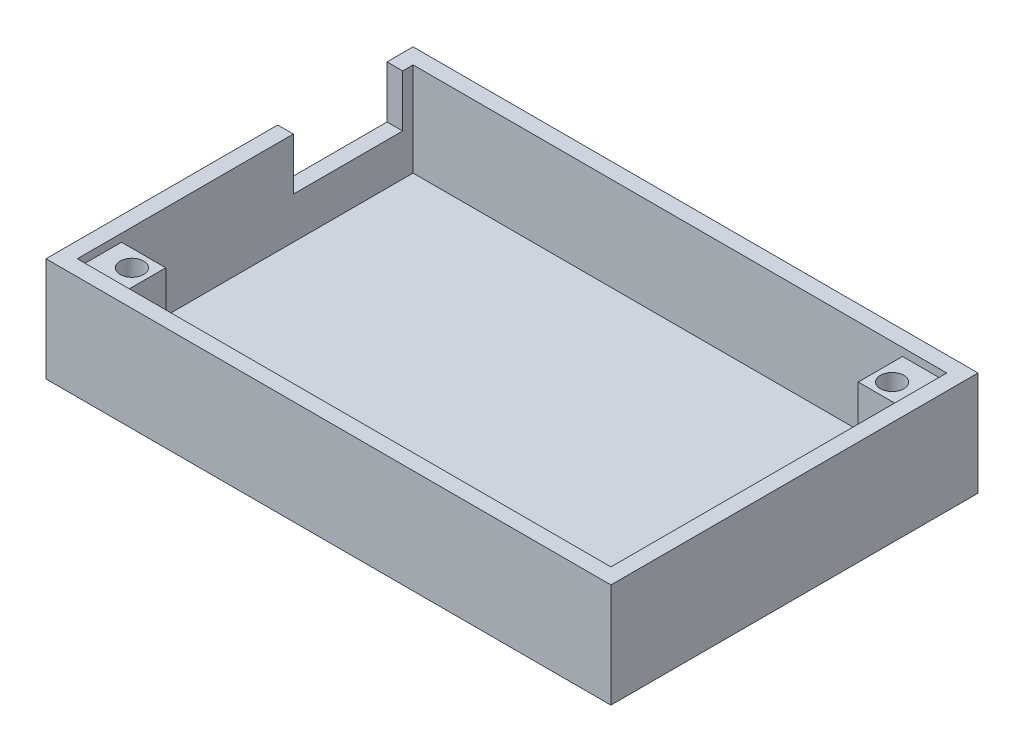
ISO-10303-21;
HEADER;
FILE_DESCRIPTION(('STEP AP214'),'2;1');
FILE_NAME('part.step','',(''),(''),'','','');
FILE_SCHEMA(('AUTOMOTIVE_DESIGN { 1 0 10303 214 1 1 1 1 }'));
ENDSEC;
DATA;
#1=APPLICATION_CONTEXT('core data for automotive mechanical design processes');
#2=APPLICATION_PROTOCOL_DEFINITION('international standard','automotive_design',2000,#1);
#3=PRODUCT_CONTEXT('',#1,'mechanical');
#4=PRODUCT('Part','Part','',(#3));
#5=PRODUCT_RELATED_PRODUCT_CATEGORY('part','',(#4));
#6=PRODUCT_DEFINITION_FORMATION('','',#4);
#7=PRODUCT_DEFINITION_CONTEXT('part definition',#1,'design');
#8=PRODUCT_DEFINITION('design','',#6,#7);
#9=PRODUCT_DEFINITION_SHAPE('','',#8);
#10=(LENGTH_UNIT() NAMED_UNIT(*) SI_UNIT(.MILLI.,.METRE.));
#11=(NAMED_UNIT(*) PLANE_ANGLE_UNIT() SI_UNIT($,.RADIAN.));
#12=(NAMED_UNIT(*) SI_UNIT($,.STERADIAN.) SOLID_ANGLE_UNIT());
#13=UNCERTAINTY_MEASURE_WITH_UNIT(LENGTH_MEASURE(1.E-05),#10,'distance_accuracy_value','');
#14=(GEOMETRIC_REPRESENTATION_CONTEXT(3) GLOBAL_UNCERTAINTY_ASSIGNED_CONTEXT((#13)) GLOBAL_UNIT_ASSIGNED_CONTEXT((#10,
#11,#12)) REPRESENTATION_CONTEXT('',''));
#15=CARTESIAN_POINT('',(0.,0.,0.));
#16=DIRECTION('',(0.,0.,1.));
#17=DIRECTION('',(1.,0.,0.));
#18=AXIS2_PLACEMENT_3D('',#15,#16,#17);
#19=CARTESIAN_POINT('',(0.,2.,0.));
#20=DIRECTION('',(0.,1.,0.));
#21=DIRECTION('',(0.,0.,1.));
#22=AXIS2_PLACEMENT_3D('',#19,#20,#21);
#23=PLANE('',#22);
#24=DIRECTION('',(-1.,0.,0.));
#25=VECTOR('',#24,1.);
#26=CARTESIAN_POINT('',(51.25,2.,-23.75));
#27=LINE('',#26,#25);
#28=CARTESIAN_POINT('',(51.25,2.,-23.75));
#29=VERTEX_POINT('',#28);
#30=CARTESIAN_POINT('',(42.75,2.,-23.75));
#31=VERTEX_POINT('',#30);
#32=EDGE_CURVE('E174',#29,#31,#27,.T.);
#33=ORIENTED_EDGE('',*,*,#32,.T.);
#34=DIRECTION('',(0.,0.,1.));
#35=VECTOR('',#34,1.);
#36=CARTESIAN_POINT('',(42.75,2.,-32.25));
#37=LINE('',#36,#35);
#38=CARTESIAN_POINT('',(42.75,2.,-32.25));
#39=VERTEX_POINT('',#38);
#40=EDGE_CURVE('E561',#39,#31,#37,.T.);
#41=ORIENTED_EDGE('',*,*,#40,.F.);
#42=DIRECTION('',(-1.,0.,0.));
#43=VECTOR('',#42,1.);
#44=CARTESIAN_POINT('',(51.25,2.,-32.25));
#45=LINE('',#44,#43);
#46=CARTESIAN_POINT('',(-51.25,2.,-32.25));
#47=VERTEX_POINT('',#46);
#48=EDGE_CURVE('E179',#39,#47,#45,.T.);
#49=ORIENTED_EDGE('',*,*,#48,.T.);
#50=DIRECTION('',(0.,0.,1.));
#51=VECTOR('',#50,1.);
#52=CARTESIAN_POINT('',(-51.25,2.,32.25));
#53=LINE('',#52,#51);
#54=CARTESIAN_POINT('',(-51.25,2.,23.75));
#55=VERTEX_POINT('',#54);
#56=EDGE_CURVE('E229',#47,#55,#53,.T.);
#57=ORIENTED_EDGE('',*,*,#56,.T.);
#58=DIRECTION('',(-1.,0.,0.));
#59=VECTOR('',#58,1.);
#60=CARTESIAN_POINT('',(-51.25,2.,23.75));
#61=LINE('',#60,#59);
#62=CARTESIAN_POINT('',(-42.75,2.,23.75));
#63=VERTEX_POINT('',#62);
#64=EDGE_CURVE('E212',#63,#55,#61,.T.);
#65=ORIENTED_EDGE('',*,*,#64,.F.);
#66=DIRECTION('',(0.,0.,-1.));
#67=VECTOR('',#66,1.);
#68=CARTESIAN_POINT('',(-42.75,2.,32.25));
#69=LINE('',#68,#67);
#70=CARTESIAN_POINT('',(-42.75,2.,32.25));
#71=VERTEX_POINT('',#70);
#72=EDGE_CURVE('E206',#71,#63,#69,.T.);
#73=ORIENTED_EDGE('',*,*,#72,.F.);
#74=DIRECTION('',(1.,0.,0.));
#75=VECTOR('',#74,1.);
#76=CARTESIAN_POINT('',(51.25,2.,32.25));
#77=LINE('',#76,#75);
#78=CARTESIAN_POINT('',(51.25,2.,32.25));
#79=VERTEX_POINT('',#78);
#80=EDGE_CURVE('E232',#71,#79,#77,.T.);
#81=ORIENTED_EDGE('',*,*,#80,.T.);
#82=DIRECTION('',(0.,0.,-1.));
#83=VECTOR('',#82,1.);
#84=CARTESIAN_POINT('',(51.25,2.,32.25));
#85=LINE('',#84,#83);
#86=EDGE_CURVE('E235',#79,#29,#85,.T.);
#87=ORIENTED_EDGE('',*,*,#86,.T.);
#88=EDGE_LOOP('',(#33,#41,#49,#57,#65,#73,#81,#87));
#89=FACE_BOUND('',#88,.T.);
#90=ADVANCED_FACE('F33',(#89),#23,.T.);
#91=CARTESIAN_POINT('',(51.25,2.,-32.25));
#92=DIRECTION('',(0.,0.,-1.));
#93=DIRECTION('',(-1.,0.,0.));
#94=AXIS2_PLACEMENT_3D('',#91,#92,#93);
#95=PLANE('',#94);
#96=DIRECTION('',(0.,-1.,0.));
#97=VECTOR('',#96,1.);
#98=CARTESIAN_POINT('',(42.75,18.5,-32.25));
#99=LINE('',#98,#97);
#100=CARTESIAN_POINT('',(42.75,18.5,-32.25));
#101=VERTEX_POINT('',#100);
#102=EDGE_CURVE('E163',#101,#39,#99,.T.);
#103=ORIENTED_EDGE('',*,*,#102,.F.);
#104=DIRECTION('',(-1.,0.,0.));
#105=VECTOR('',#104,1.);
#106=CARTESIAN_POINT('',(51.25,18.5,-32.25));
#107=LINE('',#106,#105);
#108=CARTESIAN_POINT('',(51.25,18.5,-32.25));
#109=VERTEX_POINT('',#108);
#110=EDGE_CURVE('E166',#109,#101,#107,.T.);
#111=ORIENTED_EDGE('',*,*,#110,.F.);
#112=DIRECTION('',(0.,1.,0.));
#113=VECTOR('',#112,1.);
#114=CARTESIAN_POINT('',(51.25,2.,-32.25));
#115=LINE('',#114,#113);
#116=CARTESIAN_POINT('',(51.25,20.,-32.25));
#117=VERTEX_POINT('',#116);
#118=EDGE_CURVE('E254',#109,#117,#115,.T.);
#119=ORIENTED_EDGE('',*,*,#118,.T.);
#120=DIRECTION('',(-1.,0.,0.));
#121=VECTOR('',#120,1.);
#122=CARTESIAN_POINT('',(51.25,20.,-32.25));
#123=LINE('',#122,#121);
#124=CARTESIAN_POINT('',(-51.25,20.,-32.25));
#125=VERTEX_POINT('',#124);
#126=EDGE_CURVE('E233',#117,#125,#123,.T.);
#127=ORIENTED_EDGE('',*,*,#126,.T.);
#128=DIRECTION('',(0.,1.,0.));
#129=VECTOR('',#128,1.);
#130=CARTESIAN_POINT('',(-51.25,2.,-32.25));
#131=LINE('',#130,#129);
#132=EDGE_CURVE('E251',#47,#125,#131,.T.);
#133=ORIENTED_EDGE('',*,*,#132,.F.);
#134=ORIENTED_EDGE('',*,*,#48,.F.);
#135=EDGE_LOOP('',(#103,#111,#119,#127,#133,#134));
#136=FACE_BOUND('',#135,.T.);
#137=ADVANCED_FACE('F177',(#136),#95,.F.);
#138=CARTESIAN_POINT('',(-51.25,2.,32.25));
#139=DIRECTION('',(-1.,0.,0.));
#140=DIRECTION('',(0.,0.,1.));
#141=AXIS2_PLACEMENT_3D('',#138,#139,#140);
#142=PLANE('',#141);
#143=DIRECTION('',(0.,0.,-1.));
#144=VECTOR('',#143,1.);
#145=CARTESIAN_POINT('',(-51.25,10.,-9.25));
#146=LINE('',#145,#144);
#147=CARTESIAN_POINT('',(-51.25,10.,-9.25));
#148=VERTEX_POINT('',#147);
#149=CARTESIAN_POINT('',(-51.25,10.,-30.25));
#150=VERTEX_POINT('',#149);
#151=EDGE_CURVE('E183',#148,#150,#146,.T.);
#152=ORIENTED_EDGE('',*,*,#151,.F.);
#153=DIRECTION('',(0.,-1.,0.));
#154=VECTOR('',#153,1.);
#155=CARTESIAN_POINT('',(-51.25,20.,-9.25));
#156=LINE('',#155,#154);
#157=CARTESIAN_POINT('',(-51.25,20.,-9.25));
#158=VERTEX_POINT('',#157);
#159=EDGE_CURVE('E180',#158,#148,#156,.T.);
#160=ORIENTED_EDGE('',*,*,#159,.F.);
#161=DIRECTION('',(0.,0.,1.));
#162=VECTOR('',#161,1.);
#163=CARTESIAN_POINT('',(-51.25,20.,32.25));
#164=LINE('',#163,#162);
#165=CARTESIAN_POINT('',(-51.25,20.,32.25));
#166=VERTEX_POINT('',#165);
#167=EDGE_CURVE('E228',#158,#166,#164,.T.);
#168=ORIENTED_EDGE('',*,*,#167,.T.);
#169=DIRECTION('',(0.,1.,0.));
#170=VECTOR('',#169,1.);
#171=CARTESIAN_POINT('',(-51.25,2.,32.25));
#172=LINE('',#171,#170);
#173=CARTESIAN_POINT('',(-51.25,18.5,32.25));
#174=VERTEX_POINT('',#173);
#175=EDGE_CURVE('E239',#174,#166,#172,.T.);
#176=ORIENTED_EDGE('',*,*,#175,.F.);
#177=DIRECTION('',(0.,0.,1.));
#178=VECTOR('',#177,1.);
#179=CARTESIAN_POINT('',(-51.25,18.5,32.25));
#180=LINE('',#179,#178);
#181=CARTESIAN_POINT('',(-51.25,18.5,23.75));
#182=VERTEX_POINT('',#181);
#183=EDGE_CURVE('E209',#182,#174,#180,.T.);
#184=ORIENTED_EDGE('',*,*,#183,.F.);
#185=DIRECTION('',(0.,-1.,0.));
#186=VECTOR('',#185,1.);
#187=CARTESIAN_POINT('',(-51.25,18.5,23.75));
#188=LINE('',#187,#186);
#189=EDGE_CURVE('E218',#182,#55,#188,.T.);
#190=ORIENTED_EDGE('',*,*,#189,.T.);
#191=ORIENTED_EDGE('',*,*,#56,.F.);
#192=ORIENTED_EDGE('',*,*,#132,.T.);
#193=CARTESIAN_POINT('',(-51.25,20.,-30.25));
#194=VERTEX_POINT('',#193);
#195=EDGE_CURVE('E240',#125,#194,#164,.T.);
#196=ORIENTED_EDGE('',*,*,#195,.T.);
#197=DIRECTION('',(0.,1.,0.));
#198=VECTOR('',#197,1.);
#199=CARTESIAN_POINT('',(-51.25,20.,-30.25));
#200=LINE('',#199,#198);
#201=EDGE_CURVE('E57',#150,#194,#200,.T.);
#202=ORIENTED_EDGE('',*,*,#201,.F.);
#203=EDGE_LOOP('',(#152,#160,#168,#176,#184,#190,#191,#192,#196,#202));
#204=FACE_BOUND('',#203,.T.);
#205=ADVANCED_FACE('F302',(#204),#142,.F.);
#206=CARTESIAN_POINT('',(51.25,2.,32.25));
#207=DIRECTION('',(0.,0.,1.));
#208=DIRECTION('',(1.,0.,0.));
#209=AXIS2_PLACEMENT_3D('',#206,#207,#208);
#210=PLANE('',#209);
#211=DIRECTION('',(0.,-1.,0.));
#212=VECTOR('',#211,1.);
#213=CARTESIAN_POINT('',(-42.75,18.5,32.25));
#214=LINE('',#213,#212);
#215=CARTESIAN_POINT('',(-42.75,18.5,32.25));
#216=VERTEX_POINT('',#215);
#217=EDGE_CURVE('E226',#216,#71,#214,.T.);
#218=ORIENTED_EDGE('',*,*,#217,.F.);
#219=DIRECTION('',(1.,0.,0.));
#220=VECTOR('',#219,1.);
#221=CARTESIAN_POINT('',(-51.25,18.5,32.25));
#222=LINE('',#221,#220);
#223=EDGE_CURVE('E211',#174,#216,#222,.T.);
#224=ORIENTED_EDGE('',*,*,#223,.F.);
#225=ORIENTED_EDGE('',*,*,#175,.T.);
#226=DIRECTION('',(1.,0.,0.));
#227=VECTOR('',#226,1.);
#228=CARTESIAN_POINT('',(51.25,20.,32.25));
#229=LINE('',#228,#227);
#230=CARTESIAN_POINT('',(51.25,20.,32.25));
#231=VERTEX_POINT('',#230);
#232=EDGE_CURVE('E243',#166,#231,#229,.T.);
#233=ORIENTED_EDGE('',*,*,#232,.T.);
#234=DIRECTION('',(0.,1.,0.));
#235=VECTOR('',#234,1.);
#236=CARTESIAN_POINT('',(51.25,2.,32.25));
#237=LINE('',#236,#235);
#238=EDGE_CURVE('E256',#79,#231,#237,.T.);
#239=ORIENTED_EDGE('',*,*,#238,.F.);
#240=ORIENTED_EDGE('',*,*,#80,.F.);
#241=EDGE_LOOP('',(#218,#224,#225,#233,#239,#240));
#242=FACE_BOUND('',#241,.T.);
#243=ADVANCED_FACE('F311',(#242),#210,.F.);
#244=CARTESIAN_POINT('',(-54.25,20.,35.25));
#245=DIRECTION('',(1.,0.,0.));
#246=DIRECTION('',(0.,0.,-1.));
#247=AXIS2_PLACEMENT_3D('',#244,#245,#246);
#248=PLANE('',#247);
#249=DIRECTION('',(0.,0.,1.));
#250=VECTOR('',#249,1.);
#251=CARTESIAN_POINT('',(-54.25,20.,35.25));
#252=LINE('',#251,#250);
#253=CARTESIAN_POINT('',(-54.25,20.,-9.24999999999999));
#254=VERTEX_POINT('',#253);
#255=CARTESIAN_POINT('',(-54.25,20.,35.25));
#256=VERTEX_POINT('',#255);
#257=EDGE_CURVE('E264',#254,#256,#252,.T.);
#258=ORIENTED_EDGE('',*,*,#257,.F.);
#259=DIRECTION('',(0.,-1.,0.));
#260=VECTOR('',#259,1.);
#261=CARTESIAN_POINT('',(-54.25,20.,-9.24999999999999));
#262=LINE('',#261,#260);
#263=CARTESIAN_POINT('',(-54.25,10.,-9.24999999999999));
#264=VERTEX_POINT('',#263);
#265=EDGE_CURVE('E199',#254,#264,#262,.T.);
#266=ORIENTED_EDGE('',*,*,#265,.T.);
#267=DIRECTION('',(0.,0.,-1.));
#268=VECTOR('',#267,1.);
#269=CARTESIAN_POINT('',(-54.25,9.99999999999999,35.25));
#270=LINE('',#269,#268);
#271=CARTESIAN_POINT('',(-54.25,10.,-30.25));
#272=VERTEX_POINT('',#271);
#273=EDGE_CURVE('E11',#264,#272,#270,.T.);
#274=ORIENTED_EDGE('',*,*,#273,.T.);
#275=DIRECTION('',(0.,1.,0.));
#276=VECTOR('',#275,1.);
#277=CARTESIAN_POINT('',(-54.25,20.,-30.25));
#278=LINE('',#277,#276);
#279=CARTESIAN_POINT('',(-54.25,20.,-30.25));
#280=VERTEX_POINT('',#279);
#281=EDGE_CURVE('E195',#272,#280,#278,.T.);
#282=ORIENTED_EDGE('',*,*,#281,.T.);
#283=CARTESIAN_POINT('',(-54.25,20.,-35.25));
#284=VERTEX_POINT('',#283);
#285=EDGE_CURVE('E260',#284,#280,#252,.T.);
#286=ORIENTED_EDGE('',*,*,#285,.F.);
#287=DIRECTION('',(0.,-1.,0.));
#288=VECTOR('',#287,1.);
#289=CARTESIAN_POINT('',(-54.25,20.,-35.25));
#290=LINE('',#289,#288);
#291=CARTESIAN_POINT('',(-54.25,0.,-35.25));
#292=VERTEX_POINT('',#291);
#293=EDGE_CURVE('E270',#284,#292,#290,.T.);
#294=ORIENTED_EDGE('',*,*,#293,.T.);
#295=DIRECTION('',(0.,0.,1.));
#296=VECTOR('',#295,1.);
#297=CARTESIAN_POINT('',(-54.25,0.,35.25));
#298=LINE('',#297,#296);
#299=CARTESIAN_POINT('',(-54.25,0.,35.25));
#300=VERTEX_POINT('',#299);
#301=EDGE_CURVE('E253',#292,#300,#298,.T.);
#302=ORIENTED_EDGE('',*,*,#301,.T.);
#303=DIRECTION('',(0.,-1.,0.));
#304=VECTOR('',#303,1.);
#305=CARTESIAN_POINT('',(-54.25,20.,35.25));
#306=LINE('',#305,#304);
#307=EDGE_CURVE('E287',#256,#300,#306,.T.);
#308=ORIENTED_EDGE('',*,*,#307,.F.);
#309=EDGE_LOOP('',(#258,#266,#274,#282,#286,#294,#302,#308));
#310=FACE_BOUND('',#309,.T.);
#311=ADVANCED_FACE('F35',(#310),#248,.F.);
#312=CARTESIAN_POINT('',(54.25,20.,35.25));
#313=DIRECTION('',(0.,0.,-1.));
#314=DIRECTION('',(-1.,0.,0.));
#315=AXIS2_PLACEMENT_3D('',#312,#313,#314);
#316=PLANE('',#315);
#317=DIRECTION('',(1.,0.,0.));
#318=VECTOR('',#317,1.);
#319=CARTESIAN_POINT('',(54.25,0.,35.25));
#320=LINE('',#319,#318);
#321=CARTESIAN_POINT('',(54.25,0.,35.25));
#322=VERTEX_POINT('',#321);
#323=EDGE_CURVE('E273',#300,#322,#320,.T.);
#324=ORIENTED_EDGE('',*,*,#323,.T.);
#325=DIRECTION('',(0.,-1.,0.));
#326=VECTOR('',#325,1.);
#327=CARTESIAN_POINT('',(54.25,20.,35.25));
#328=LINE('',#327,#326);
#329=CARTESIAN_POINT('',(54.25,20.,35.25));
#330=VERTEX_POINT('',#329);
#331=EDGE_CURVE('E284',#330,#322,#328,.T.);
#332=ORIENTED_EDGE('',*,*,#331,.F.);
#333=DIRECTION('',(1.,0.,0.));
#334=VECTOR('',#333,1.);
#335=CARTESIAN_POINT('',(54.25,20.,35.25));
#336=LINE('',#335,#334);
#337=EDGE_CURVE('E263',#256,#330,#336,.T.);
#338=ORIENTED_EDGE('',*,*,#337,.F.);
#339=ORIENTED_EDGE('',*,*,#307,.T.);
#340=EDGE_LOOP('',(#324,#332,#338,#339));
#341=FACE_BOUND('',#340,.T.);
#342=ADVANCED_FACE('F378',(#341),#316,.F.);
#343=CARTESIAN_POINT('',(54.25,20.,35.25));
#344=DIRECTION('',(-1.,0.,0.));
#345=DIRECTION('',(0.,0.,1.));
#346=AXIS2_PLACEMENT_3D('',#343,#344,#345);
#347=PLANE('',#346);
#348=DIRECTION('',(0.,0.,-1.));
#349=VECTOR('',#348,1.);
#350=CARTESIAN_POINT('',(54.25,0.,35.25));
#351=LINE('',#350,#349);
#352=CARTESIAN_POINT('',(54.25,0.,-35.25));
#353=VERTEX_POINT('',#352);
#354=EDGE_CURVE('E275',#322,#353,#351,.T.);
#355=ORIENTED_EDGE('',*,*,#354,.T.);
#356=DIRECTION('',(0.,-1.,0.));
#357=VECTOR('',#356,1.);
#358=CARTESIAN_POINT('',(54.25,20.,-35.25));
#359=LINE('',#358,#357);
#360=CARTESIAN_POINT('',(54.25,20.,-35.25));
#361=VERTEX_POINT('',#360);
#362=EDGE_CURVE('E281',#361,#353,#359,.T.);
#363=ORIENTED_EDGE('',*,*,#362,.F.);
#364=DIRECTION('',(0.,0.,-1.));
#365=VECTOR('',#364,1.);
#366=CARTESIAN_POINT('',(54.25,20.,35.25));
#367=LINE('',#366,#365);
#368=EDGE_CURVE('E266',#330,#361,#367,.T.);
#369=ORIENTED_EDGE('',*,*,#368,.F.);
#370=ORIENTED_EDGE('',*,*,#331,.T.);
#371=EDGE_LOOP('',(#355,#363,#369,#370));
#372=FACE_BOUND('',#371,.T.);
#373=ADVANCED_FACE('F375',(#372),#347,.F.);
#374=CARTESIAN_POINT('',(54.25,20.,-35.25));
#375=DIRECTION('',(0.,0.,1.));
#376=DIRECTION('',(1.,0.,0.));
#377=AXIS2_PLACEMENT_3D('',#374,#375,#376);
#378=PLANE('',#377);
#379=DIRECTION('',(-1.,0.,0.));
#380=VECTOR('',#379,1.);
#381=CARTESIAN_POINT('',(54.25,0.,-35.25));
#382=LINE('',#381,#380);
#383=EDGE_CURVE('E277',#353,#292,#382,.T.);
#384=ORIENTED_EDGE('',*,*,#383,.T.);
#385=ORIENTED_EDGE('',*,*,#293,.F.);
#386=DIRECTION('',(-1.,0.,0.));
#387=VECTOR('',#386,1.);
#388=CARTESIAN_POINT('',(54.25,20.,-35.25));
#389=LINE('',#388,#387);
#390=EDGE_CURVE('E268',#361,#284,#389,.T.);
#391=ORIENTED_EDGE('',*,*,#390,.F.);
#392=ORIENTED_EDGE('',*,*,#362,.T.);
#393=EDGE_LOOP('',(#384,#385,#391,#392));
#394=FACE_BOUND('',#393,.T.);
#395=ADVANCED_FACE('F369',(#394),#378,.F.);
#396=CARTESIAN_POINT('',(0.,20.,0.));
#397=DIRECTION('',(0.,1.,0.));
#398=DIRECTION('',(0.,0.,1.));
#399=AXIS2_PLACEMENT_3D('',#396,#397,#398);
#400=PLANE('',#399);
#401=DIRECTION('',(1.,0.,0.));
#402=VECTOR('',#401,1.);
#403=CARTESIAN_POINT('',(0.,20.,-9.25));
#404=LINE('',#403,#402);
#405=EDGE_CURVE('E42',#254,#158,#404,.T.);
#406=ORIENTED_EDGE('',*,*,#405,.F.);
#407=ORIENTED_EDGE('',*,*,#257,.T.);
#408=ORIENTED_EDGE('',*,*,#337,.T.);
#409=ORIENTED_EDGE('',*,*,#368,.T.);
#410=ORIENTED_EDGE('',*,*,#390,.T.);
#411=ORIENTED_EDGE('',*,*,#285,.T.);
#412=DIRECTION('',(-1.,0.,0.));
#413=VECTOR('',#412,1.);
#414=CARTESIAN_POINT('',(0.,20.,-30.25));
#415=LINE('',#414,#413);
#416=EDGE_CURVE('E290',#194,#280,#415,.T.);
#417=ORIENTED_EDGE('',*,*,#416,.F.);
#418=ORIENTED_EDGE('',*,*,#195,.F.);
#419=ORIENTED_EDGE('',*,*,#126,.F.);
#420=DIRECTION('',(0.,0.,-1.));
#421=VECTOR('',#420,1.);
#422=CARTESIAN_POINT('',(51.25,20.,32.25));
#423=LINE('',#422,#421);
#424=EDGE_CURVE('E246',#231,#117,#423,.T.);
#425=ORIENTED_EDGE('',*,*,#424,.F.);
#426=ORIENTED_EDGE('',*,*,#232,.F.);
#427=ORIENTED_EDGE('',*,*,#167,.F.);
#428=EDGE_LOOP('',(#406,#407,#408,#409,#410,#411,#417,#418,#419,#425,#426,#427));
#429=FACE_BOUND('',#428,.T.);
#430=ADVANCED_FACE('F305',(#429),#400,.T.);
#431=CARTESIAN_POINT('',(0.,0.,0.));
#432=DIRECTION('',(0.,1.,0.));
#433=DIRECTION('',(0.,0.,1.));
#434=AXIS2_PLACEMENT_3D('',#431,#432,#433);
#435=PLANE('',#434);
#436=ORIENTED_EDGE('',*,*,#301,.F.);
#437=ORIENTED_EDGE('',*,*,#383,.F.);
#438=ORIENTED_EDGE('',*,*,#354,.F.);
#439=ORIENTED_EDGE('',*,*,#323,.F.);
#440=EDGE_LOOP('',(#436,#437,#438,#439));
#441=FACE_BOUND('',#440,.T.);
#442=ADVANCED_FACE('F361',(#441),#435,.F.);
#443=CARTESIAN_POINT('',(51.25,2.,32.25));
#444=DIRECTION('',(1.,0.,0.));
#445=DIRECTION('',(0.,0.,-1.));
#446=AXIS2_PLACEMENT_3D('',#443,#444,#445);
#447=PLANE('',#446);
#448=DIRECTION('',(0.,0.,1.));
#449=VECTOR('',#448,1.);
#450=CARTESIAN_POINT('',(51.25,18.5,-32.25));
#451=LINE('',#450,#449);
#452=CARTESIAN_POINT('',(51.25,18.5,-23.75));
#453=VERTEX_POINT('',#452);
#454=EDGE_CURVE('E171',#109,#453,#451,.T.);
#455=ORIENTED_EDGE('',*,*,#454,.T.);
#456=DIRECTION('',(0.,-1.,0.));
#457=VECTOR('',#456,1.);
#458=CARTESIAN_POINT('',(51.25,18.5,-23.75));
#459=LINE('',#458,#457);
#460=EDGE_CURVE('E185',#453,#29,#459,.T.);
#461=ORIENTED_EDGE('',*,*,#460,.T.);
#462=ORIENTED_EDGE('',*,*,#86,.F.);
#463=ORIENTED_EDGE('',*,*,#238,.T.);
#464=ORIENTED_EDGE('',*,*,#424,.T.);
#465=ORIENTED_EDGE('',*,*,#118,.F.);
#466=EDGE_LOOP('',(#455,#461,#462,#463,#464,#465));
#467=FACE_BOUND('',#466,.T.);
#468=ADVANCED_FACE('F358',(#467),#447,.F.);
#469=CARTESIAN_POINT('',(-42.75,18.5,32.25));
#470=DIRECTION('',(-1.,0.,0.));
#471=DIRECTION('',(0.,0.,1.));
#472=AXIS2_PLACEMENT_3D('',#469,#470,#471);
#473=PLANE('',#472);
#474=ORIENTED_EDGE('',*,*,#72,.T.);
#475=DIRECTION('',(0.,-1.,0.));
#476=VECTOR('',#475,1.);
#477=CARTESIAN_POINT('',(-42.75,18.5,23.75));
#478=LINE('',#477,#476);
#479=CARTESIAN_POINT('',(-42.75,18.5,23.75));
#480=VERTEX_POINT('',#479);
#481=EDGE_CURVE('E224',#480,#63,#478,.T.);
#482=ORIENTED_EDGE('',*,*,#481,.F.);
#483=DIRECTION('',(0.,0.,-1.));
#484=VECTOR('',#483,1.);
#485=CARTESIAN_POINT('',(-42.75,18.5,32.25));
#486=LINE('',#485,#484);
#487=EDGE_CURVE('E214',#216,#480,#486,.T.);
#488=ORIENTED_EDGE('',*,*,#487,.F.);
#489=ORIENTED_EDGE('',*,*,#217,.T.);
#490=EDGE_LOOP('',(#474,#482,#488,#489));
#491=FACE_BOUND('',#490,.T.);
#492=ADVANCED_FACE('F355',(#491),#473,.F.);
#493=CARTESIAN_POINT('',(-51.25,18.5,23.75));
#494=DIRECTION('',(0.,0.,1.));
#495=DIRECTION('',(1.,0.,0.));
#496=AXIS2_PLACEMENT_3D('',#493,#494,#495);
#497=PLANE('',#496);
#498=ORIENTED_EDGE('',*,*,#64,.T.);
#499=ORIENTED_EDGE('',*,*,#189,.F.);
#500=DIRECTION('',(-1.,0.,0.));
#501=VECTOR('',#500,1.);
#502=CARTESIAN_POINT('',(-51.25,18.5,23.75));
#503=LINE('',#502,#501);
#504=EDGE_CURVE('E216',#480,#182,#503,.T.);
#505=ORIENTED_EDGE('',*,*,#504,.F.);
#506=ORIENTED_EDGE('',*,*,#481,.T.);
#507=EDGE_LOOP('',(#498,#499,#505,#506));
#508=FACE_BOUND('',#507,.T.);
#509=ADVANCED_FACE('F324',(#508),#497,.F.);
#510=CARTESIAN_POINT('',(0.,18.5,0.));
#511=DIRECTION('',(0.,-1.,0.));
#512=DIRECTION('',(0.,0.,-1.));
#513=AXIS2_PLACEMENT_3D('',#510,#511,#512);
#514=PLANE('',#513);
#515=CARTESIAN_POINT('',(-46.,18.5,27.));
#516=DIRECTION('',(0.,1.,0.));
#517=DIRECTION('',(0.,0.,1.));
#518=AXIS2_PLACEMENT_3D('',#515,#516,#517);
#519=CIRCLE('',#518,2.25);
#520=CARTESIAN_POINT('',(-46.,18.5,29.25));
#521=VERTEX_POINT('',#520);
#522=EDGE_CURVE('E202',#521,#521,#519,.T.);
#523=ORIENTED_EDGE('',*,*,#522,.F.);
#524=EDGE_LOOP('',(#523));
#525=FACE_BOUND('',#524,.T.);
#526=ORIENTED_EDGE('',*,*,#183,.T.);
#527=ORIENTED_EDGE('',*,*,#223,.T.);
#528=ORIENTED_EDGE('',*,*,#487,.T.);
#529=ORIENTED_EDGE('',*,*,#504,.T.);
#530=EDGE_LOOP('',(#526,#527,#528,#529));
#531=FACE_BOUND('',#530,.T.);
#532=ADVANCED_FACE('F319',(#525,#531),#514,.F.);
#533=CARTESIAN_POINT('',(-46.,3.5,27.));
#534=DIRECTION('',(0.,1.,0.));
#535=DIRECTION('',(0.,0.,1.));
#536=AXIS2_PLACEMENT_3D('',#533,#534,#535);
#537=CYLINDRICAL_SURFACE('',#536,2.25);
#538=CARTESIAN_POINT('',(-46.,3.5,27.));
#539=DIRECTION('',(0.,1.,0.));
#540=DIRECTION('',(0.,0.,1.));
#541=AXIS2_PLACEMENT_3D('',#538,#539,#540);
#542=CIRCLE('',#541,2.25);
#543=CARTESIAN_POINT('',(-46.,3.5,29.25));
#544=VERTEX_POINT('',#543);
#545=EDGE_CURVE('E203',#544,#544,#542,.T.);
#546=ORIENTED_EDGE('',*,*,#545,.F.);
#547=EDGE_LOOP('',(#546));
#548=FACE_BOUND('',#547,.T.);
#549=ORIENTED_EDGE('',*,*,#522,.T.);
#550=EDGE_LOOP('',(#549));
#551=FACE_BOUND('',#550,.T.);
#552=ADVANCED_FACE('F344',(#548,#551),#537,.F.);
#553=CARTESIAN_POINT('',(-46.,3.5,27.));
#554=DIRECTION('',(0.,1.,0.));
#555=DIRECTION('',(0.,0.,1.));
#556=AXIS2_PLACEMENT_3D('',#553,#554,#555);
#557=PLANE('',#556);
#558=ORIENTED_EDGE('',*,*,#545,.T.);
#559=EDGE_LOOP('',(#558));
#560=FACE_BOUND('',#559,.T.);
#561=ADVANCED_FACE('F337',(#560),#557,.T.);
#562=CARTESIAN_POINT('',(-59.25,10.,-9.24999999999999));
#563=DIRECTION('',(0.,-1.,0.));
#564=DIRECTION('',(0.,0.,-1.));
#565=AXIS2_PLACEMENT_3D('',#562,#563,#564);
#566=PLANE('',#565);
#567=DIRECTION('',(1.,0.,0.));
#568=VECTOR('',#567,1.);
#569=CARTESIAN_POINT('',(-59.25,10.,-9.24999999999999));
#570=LINE('',#569,#568);
#571=EDGE_CURVE('E192',#264,#148,#570,.T.);
#572=ORIENTED_EDGE('',*,*,#571,.T.);
#573=ORIENTED_EDGE('',*,*,#151,.T.);
#574=DIRECTION('',(1.,0.,0.));
#575=VECTOR('',#574,1.);
#576=CARTESIAN_POINT('',(-59.25,10.,-30.25));
#577=LINE('',#576,#575);
#578=EDGE_CURVE('E193',#272,#150,#577,.T.);
#579=ORIENTED_EDGE('',*,*,#578,.F.);
#580=ORIENTED_EDGE('',*,*,#273,.F.);
#581=EDGE_LOOP('',(#572,#573,#579,#580));
#582=FACE_BOUND('',#581,.T.);
#583=ADVANCED_FACE('F335',(#582),#566,.F.);
#584=CARTESIAN_POINT('',(-59.25,20.,-9.24999999999999));
#585=DIRECTION('',(0.,0.,1.));
#586=DIRECTION('',(1.,0.,0.));
#587=AXIS2_PLACEMENT_3D('',#584,#585,#586);
#588=PLANE('',#587);
#589=ORIENTED_EDGE('',*,*,#405,.T.);
#590=ORIENTED_EDGE('',*,*,#159,.T.);
#591=ORIENTED_EDGE('',*,*,#571,.F.);
#592=ORIENTED_EDGE('',*,*,#265,.F.);
#593=EDGE_LOOP('',(#589,#590,#591,#592));
#594=FACE_BOUND('',#593,.T.);
#595=ADVANCED_FACE('F295',(#594),#588,.F.);
#596=CARTESIAN_POINT('',(-59.25,20.,-30.25));
#597=DIRECTION('',(0.,0.,-1.));
#598=DIRECTION('',(-1.,0.,0.));
#599=AXIS2_PLACEMENT_3D('',#596,#597,#598);
#600=PLANE('',#599);
#601=ORIENTED_EDGE('',*,*,#578,.T.);
#602=ORIENTED_EDGE('',*,*,#201,.T.);
#603=ORIENTED_EDGE('',*,*,#416,.T.);
#604=ORIENTED_EDGE('',*,*,#281,.F.);
#605=EDGE_LOOP('',(#601,#602,#603,#604));
#606=FACE_BOUND('',#605,.T.);
#607=ADVANCED_FACE('F331',(#606),#600,.F.);
#608=CARTESIAN_POINT('',(42.75,18.5,-32.25));
#609=DIRECTION('',(1.,0.,0.));
#610=DIRECTION('',(0.,0.,-1.));
#611=AXIS2_PLACEMENT_3D('',#608,#609,#610);
#612=PLANE('',#611);
#613=ORIENTED_EDGE('',*,*,#40,.T.);
#614=DIRECTION('',(0.,-1.,0.));
#615=VECTOR('',#614,1.);
#616=CARTESIAN_POINT('',(42.75,18.5,-23.75));
#617=LINE('',#616,#615);
#618=CARTESIAN_POINT('',(42.75,18.5,-23.75));
#619=VERTEX_POINT('',#618);
#620=EDGE_CURVE('E165',#619,#31,#617,.T.);
#621=ORIENTED_EDGE('',*,*,#620,.F.);
#622=DIRECTION('',(0.,0.,1.));
#623=VECTOR('',#622,1.);
#624=CARTESIAN_POINT('',(42.75,18.5,-32.25));
#625=LINE('',#624,#623);
#626=EDGE_CURVE('E158',#101,#619,#625,.T.);
#627=ORIENTED_EDGE('',*,*,#626,.F.);
#628=ORIENTED_EDGE('',*,*,#102,.T.);
#629=EDGE_LOOP('',(#613,#621,#627,#628));
#630=FACE_BOUND('',#629,.T.);
#631=ADVANCED_FACE('F161',(#630),#612,.F.);
#632=CARTESIAN_POINT('',(51.25,18.5,-23.75));
#633=DIRECTION('',(0.,0.,1.));
#634=DIRECTION('',(1.,0.,0.));
#635=AXIS2_PLACEMENT_3D('',#632,#633,#634);
#636=PLANE('',#635);
#637=ORIENTED_EDGE('',*,*,#32,.F.);
#638=ORIENTED_EDGE('',*,*,#460,.F.);
#639=DIRECTION('',(-1.,0.,0.));
#640=VECTOR('',#639,1.);
#641=CARTESIAN_POINT('',(51.25,18.5,-23.75));
#642=LINE('',#641,#640);
#643=EDGE_CURVE('E49',#453,#619,#642,.T.);
#644=ORIENTED_EDGE('',*,*,#643,.T.);
#645=ORIENTED_EDGE('',*,*,#620,.T.);
#646=EDGE_LOOP('',(#637,#638,#644,#645));
#647=FACE_BOUND('',#646,.T.);
#648=ADVANCED_FACE('F434',(#647),#636,.T.);
#649=CARTESIAN_POINT('',(0.,18.5,0.));
#650=DIRECTION('',(0.,1.,0.));
#651=DIRECTION('',(0.,0.,1.));
#652=AXIS2_PLACEMENT_3D('',#649,#650,#651);
#653=PLANE('',#652);
#654=CARTESIAN_POINT('',(46.,18.5,-27.));
#655=DIRECTION('',(0.,1.,0.));
#656=DIRECTION('',(0.,0.,1.));
#657=AXIS2_PLACEMENT_3D('',#654,#655,#656);
#658=CIRCLE('',#657,2.25);
#659=CARTESIAN_POINT('',(46.,18.5,-29.25));
#660=VERTEX_POINT('',#659);
#661=EDGE_CURVE('E37',#660,#660,#658,.F.);
#662=ORIENTED_EDGE('',*,*,#661,.T.);
#663=EDGE_LOOP('',(#662));
#664=FACE_BOUND('',#663,.T.);
#665=ORIENTED_EDGE('',*,*,#110,.T.);
#666=ORIENTED_EDGE('',*,*,#626,.T.);
#667=ORIENTED_EDGE('',*,*,#643,.F.);
#668=ORIENTED_EDGE('',*,*,#454,.F.);
#669=EDGE_LOOP('',(#665,#666,#667,#668));
#670=FACE_BOUND('',#669,.T.);
#671=ADVANCED_FACE('F169',(#664,#670),#653,.T.);
#672=CARTESIAN_POINT('',(46.,31.5,-27.));
#673=DIRECTION('',(0.,-1.,0.));
#674=DIRECTION('',(0.,0.,-1.));
#675=AXIS2_PLACEMENT_3D('',#672,#673,#674);
#676=CYLINDRICAL_SURFACE('',#675,2.25);
#677=CARTESIAN_POINT('',(46.,3.5,-27.));
#678=DIRECTION('',(0.,1.,0.));
#679=DIRECTION('',(0.,0.,1.));
#680=AXIS2_PLACEMENT_3D('',#677,#678,#679);
#681=CIRCLE('',#680,2.25);
#682=CARTESIAN_POINT('',(46.,3.5,-29.25));
#683=VERTEX_POINT('',#682);
#684=EDGE_CURVE('E564',#683,#683,#681,.T.);
#685=CARTESIAN_POINT('',(46.,18.5,-29.25));
#686=CARTESIAN_POINT('',(46.,18.34375,-29.25));
#687=CARTESIAN_POINT('',(46.,18.1875,-29.25));
#688=CARTESIAN_POINT('',(46.,17.875,-29.25));
#689=CARTESIAN_POINT('',(46.,17.71875,-29.25));
#690=CARTESIAN_POINT('',(46.,17.40625,-29.25));
#691=CARTESIAN_POINT('',(46.,17.25,-29.25));
#692=CARTESIAN_POINT('',(46.,16.9375,-29.25));
#693=CARTESIAN_POINT('',(46.,16.78125,-29.25));
#694=CARTESIAN_POINT('',(46.,16.46875,-29.25));
#695=CARTESIAN_POINT('',(46.,16.3125,-29.25));
#696=CARTESIAN_POINT('',(46.,16.,-29.25));
#697=CARTESIAN_POINT('',(46.,15.84375,-29.25));
#698=CARTESIAN_POINT('',(46.,15.53125,-29.25));
#699=CARTESIAN_POINT('',(46.,15.375,-29.25));
#700=CARTESIAN_POINT('',(46.,15.0625,-29.25));
#701=CARTESIAN_POINT('',(46.,14.90625,-29.25));
#702=CARTESIAN_POINT('',(46.,14.59375,-29.25));
#703=CARTESIAN_POINT('',(46.,14.4375,-29.25));
#704=CARTESIAN_POINT('',(46.,14.125,-29.25));
#705=CARTESIAN_POINT('',(46.,13.96875,-29.25));
#706=CARTESIAN_POINT('',(46.,13.65625,-29.25));
#707=CARTESIAN_POINT('',(46.,13.5,-29.25));
#708=CARTESIAN_POINT('',(46.,13.1875,-29.25));
#709=CARTESIAN_POINT('',(46.,13.03125,-29.25));
#710=CARTESIAN_POINT('',(46.,12.71875,-29.25));
#711=CARTESIAN_POINT('',(46.,12.5625,-29.25));
#712=CARTESIAN_POINT('',(46.,12.25,-29.25));
#713=CARTESIAN_POINT('',(46.,12.09375,-29.25));
#714=CARTESIAN_POINT('',(46.,11.78125,-29.25));
#715=CARTESIAN_POINT('',(46.,11.625,-29.25));
#716=CARTESIAN_POINT('',(46.,11.3125,-29.25));
#717=CARTESIAN_POINT('',(46.,11.15625,-29.25));
#718=CARTESIAN_POINT('',(46.,10.84375,-29.25));
#719=CARTESIAN_POINT('',(46.,10.6875,-29.25));
#720=CARTESIAN_POINT('',(46.,10.375,-29.25));
#721=CARTESIAN_POINT('',(46.,10.21875,-29.25));
#722=CARTESIAN_POINT('',(46.,9.90625,-29.25));
#723=CARTESIAN_POINT('',(46.,9.75,-29.25));
#724=CARTESIAN_POINT('',(46.,9.4375,-29.25));
#725=CARTESIAN_POINT('',(46.,9.28125,-29.25));
#726=CARTESIAN_POINT('',(46.,8.96875,-29.25));
#727=CARTESIAN_POINT('',(46.,8.8125,-29.25));
#728=CARTESIAN_POINT('',(46.,8.5,-29.25));
#729=CARTESIAN_POINT('',(46.,8.34375,-29.25));
#730=CARTESIAN_POINT('',(46.,8.03125,-29.25));
#731=CARTESIAN_POINT('',(46.,7.875,-29.25));
#732=CARTESIAN_POINT('',(46.,7.5625,-29.25));
#733=CARTESIAN_POINT('',(46.,7.40625,-29.25));
#734=CARTESIAN_POINT('',(46.,7.09375,-29.25));
#735=CARTESIAN_POINT('',(46.,6.9375,-29.25));
#736=CARTESIAN_POINT('',(46.,6.625,-29.25));
#737=CARTESIAN_POINT('',(46.,6.46875,-29.25));
#738=CARTESIAN_POINT('',(46.,6.15625,-29.25));
#739=CARTESIAN_POINT('',(46.,6.,-29.25));
#740=CARTESIAN_POINT('',(46.,5.6875,-29.25));
#741=CARTESIAN_POINT('',(46.,5.53125,-29.25));
#742=CARTESIAN_POINT('',(46.,5.21875,-29.25));
#743=CARTESIAN_POINT('',(46.,5.0625,-29.25));
#744=CARTESIAN_POINT('',(46.,4.75,-29.25));
#745=CARTESIAN_POINT('',(46.,4.59375,-29.25));
#746=CARTESIAN_POINT('',(46.,4.28125,-29.25));
#747=CARTESIAN_POINT('',(46.,4.125,-29.25));
#748=CARTESIAN_POINT('',(46.,3.8125,-29.25));
#749=CARTESIAN_POINT('',(46.,3.65625,-29.25));
#750=CARTESIAN_POINT('',(46.,3.5,-29.25));
#751=B_SPLINE_CURVE_WITH_KNOTS('',3,(#685,#686,#687,#688,#689,#690,#691,#692,#693,#694,#695,
#696,#697,#698,#699,#700,#701,#702,#703,#704,#705,#706,#707,#708,#709,#710,#711,#712,#713,#714,
#715,#716,#717,#718,#719,#720,#721,#722,#723,#724,#725,#726,#727,#728,#729,#730,#731,#732,#733,
#734,#735,#736,#737,#738,#739,#740,#741,#742,#743,#744,#745,#746,#747,#748,#749,#750),
.UNSPECIFIED.,.F.,.F.,(4,2,2,2,2,2,2,2,2,2,2,2,2,2,2,2,2,2,2,2,2,2,2,2,2,2,2,2,2,2,2,2,4),(0.,
0.468750000000004,0.937500000000001,1.40625,1.875,2.34375,2.8125,3.28125,3.75,4.21875,4.6875,
5.15625,5.625,6.09375,6.5625,7.03125,7.5,7.96875,8.4375,8.90625,9.375,9.84375,10.3125,10.78125,
11.25,11.71875,12.1875,12.65625,13.125,13.59375,14.0625,14.53125,15.),.UNSPECIFIED.);
#752=EDGE_CURVE('BSEAM453',#660,#683,#751,.T.);
#753=ORIENTED_EDGE('',*,*,#661,.F.);
#754=ORIENTED_EDGE('',*,*,#684,.F.);
#755=ORIENTED_EDGE('',*,*,#752,.T.);
#756=ORIENTED_EDGE('',*,*,#752,.F.);
#757=EDGE_LOOP('',(#753,#755,#754,#756));
#758=FACE_BOUND('',#757,.T.);
#759=ADVANCED_FACE('F453',(#758),#676,.F.);
#760=CARTESIAN_POINT('',(46.,3.5,-27.));
#761=DIRECTION('',(0.,1.,0.));
#762=DIRECTION('',(0.,0.,1.));
#763=AXIS2_PLACEMENT_3D('',#760,#761,#762);
#764=PLANE('',#763);
#765=ORIENTED_EDGE('',*,*,#684,.T.);
#766=EDGE_LOOP('',(#765));
#767=FACE_BOUND('',#766,.T.);
#768=ADVANCED_FACE('F463',(#767),#764,.T.);
#769=CLOSED_SHELL('',(#90,#137,#205,#243,#311,#342,#373,#395,#430,#442,#468,#492,#509,#532,#552,
#561,#583,#595,#607,#631,#648,#671,#759,#768));
#770=MANIFOLD_SOLID_BREP('B2',#769);
#771=ADVANCED_BREP_SHAPE_REPRESENTATION('',(#18,#770),#14);
#772=SHAPE_DEFINITION_REPRESENTATION(#9,#771);
ENDSEC;
END-ISO-10303-21;
